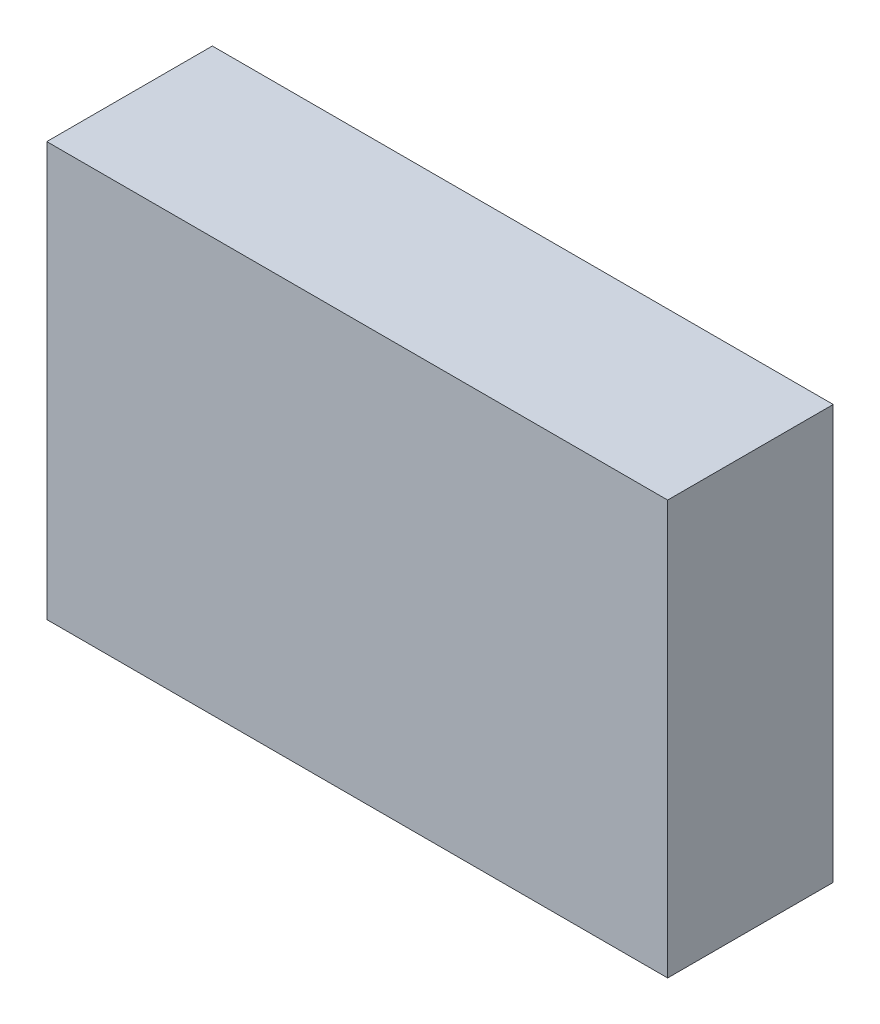
ISO-10303-21;
HEADER;
FILE_DESCRIPTION(('STEP AP214'),'2;1');
FILE_NAME('part.step','',(''),(''),'','','');
FILE_SCHEMA(('AUTOMOTIVE_DESIGN { 1 0 10303 214 1 1 1 1 }'));
ENDSEC;
DATA;
#1=APPLICATION_CONTEXT('core data for automotive mechanical design processes');
#2=APPLICATION_PROTOCOL_DEFINITION('international standard','automotive_design',2000,#1);
#3=PRODUCT_CONTEXT('',#1,'mechanical');
#4=PRODUCT('Part','Part','',(#3));
#5=PRODUCT_RELATED_PRODUCT_CATEGORY('part','',(#4));
#6=PRODUCT_DEFINITION_FORMATION('','',#4);
#7=PRODUCT_DEFINITION_CONTEXT('part definition',#1,'design');
#8=PRODUCT_DEFINITION('design','',#6,#7);
#9=PRODUCT_DEFINITION_SHAPE('','',#8);
#10=(LENGTH_UNIT() NAMED_UNIT(*) SI_UNIT(.MILLI.,.METRE.));
#11=(NAMED_UNIT(*) PLANE_ANGLE_UNIT() SI_UNIT($,.RADIAN.));
#12=(NAMED_UNIT(*) SI_UNIT($,.STERADIAN.) SOLID_ANGLE_UNIT());
#13=UNCERTAINTY_MEASURE_WITH_UNIT(LENGTH_MEASURE(1.E-05),#10,'distance_accuracy_value','');
#14=(GEOMETRIC_REPRESENTATION_CONTEXT(3) GLOBAL_UNCERTAINTY_ASSIGNED_CONTEXT((#13)) GLOBAL_UNIT_ASSIGNED_CONTEXT((#10,
#11,#12)) REPRESENTATION_CONTEXT('',''));
#15=CARTESIAN_POINT('',(0.,0.,0.));
#16=DIRECTION('',(0.,0.,1.));
#17=DIRECTION('',(1.,0.,0.));
#18=AXIS2_PLACEMENT_3D('',#15,#16,#17);
#19=CARTESIAN_POINT('',(18.75,-12.5,10.));
#20=DIRECTION('',(-1.,0.,0.));
#21=DIRECTION('',(0.,0.,1.));
#22=AXIS2_PLACEMENT_3D('',#19,#20,#21);
#23=PLANE('',#22);
#24=DIRECTION('',(0.,1.,0.));
#25=VECTOR('',#24,1.);
#26=CARTESIAN_POINT('',(18.75,-12.5,0.));
#27=LINE('',#26,#25);
#28=CARTESIAN_POINT('',(18.75,-12.5,0.));
#29=VERTEX_POINT('',#28);
#30=CARTESIAN_POINT('',(18.75,12.5,0.));
#31=VERTEX_POINT('',#30);
#32=EDGE_CURVE('E96',#29,#31,#27,.T.);
#33=ORIENTED_EDGE('',*,*,#32,.T.);
#34=DIRECTION('',(0.,0.,-1.));
#35=VECTOR('',#34,1.);
#36=CARTESIAN_POINT('',(18.75,12.5,10.));
#37=LINE('',#36,#35);
#38=CARTESIAN_POINT('',(18.75,12.5,10.));
#39=VERTEX_POINT('',#38);
#40=EDGE_CURVE('E11',#39,#31,#37,.T.);
#41=ORIENTED_EDGE('',*,*,#40,.F.);
#42=DIRECTION('',(0.,1.,0.));
#43=VECTOR('',#42,1.);
#44=CARTESIAN_POINT('',(18.75,-12.5,10.));
#45=LINE('',#44,#43);
#46=CARTESIAN_POINT('',(18.75,-12.5,10.));
#47=VERTEX_POINT('',#46);
#48=EDGE_CURVE('E84',#47,#39,#45,.T.);
#49=ORIENTED_EDGE('',*,*,#48,.F.);
#50=DIRECTION('',(0.,0.,-1.));
#51=VECTOR('',#50,1.);
#52=CARTESIAN_POINT('',(18.75,-12.5,10.));
#53=LINE('',#52,#51);
#54=EDGE_CURVE('E92',#47,#29,#53,.T.);
#55=ORIENTED_EDGE('',*,*,#54,.T.);
#56=EDGE_LOOP('',(#33,#41,#49,#55));
#57=FACE_BOUND('',#56,.T.);
#58=ADVANCED_FACE('F33',(#57),#23,.F.);
#59=CARTESIAN_POINT('',(-18.75,12.5,10.));
#60=DIRECTION('',(0.,-1.,0.));
#61=DIRECTION('',(0.,0.,-1.));
#62=AXIS2_PLACEMENT_3D('',#59,#60,#61);
#63=PLANE('',#62);
#64=DIRECTION('',(-1.,0.,0.));
#65=VECTOR('',#64,1.);
#66=CARTESIAN_POINT('',(-18.75,12.5,0.));
#67=LINE('',#66,#65);
#68=CARTESIAN_POINT('',(-18.75,12.5,0.));
#69=VERTEX_POINT('',#68);
#70=EDGE_CURVE('E88',#31,#69,#67,.T.);
#71=ORIENTED_EDGE('',*,*,#70,.T.);
#72=DIRECTION('',(0.,0.,-1.));
#73=VECTOR('',#72,1.);
#74=CARTESIAN_POINT('',(-18.75,12.5,10.));
#75=LINE('',#74,#73);
#76=CARTESIAN_POINT('',(-18.75,12.5,10.));
#77=VERTEX_POINT('',#76);
#78=EDGE_CURVE('E41',#77,#69,#75,.T.);
#79=ORIENTED_EDGE('',*,*,#78,.F.);
#80=DIRECTION('',(-1.,0.,0.));
#81=VECTOR('',#80,1.);
#82=CARTESIAN_POINT('',(-18.75,12.5,10.));
#83=LINE('',#82,#81);
#84=EDGE_CURVE('E79',#39,#77,#83,.T.);
#85=ORIENTED_EDGE('',*,*,#84,.F.);
#86=ORIENTED_EDGE('',*,*,#40,.T.);
#87=EDGE_LOOP('',(#71,#79,#85,#86));
#88=FACE_BOUND('',#87,.T.);
#89=ADVANCED_FACE('F87',(#88),#63,.F.);
#90=CARTESIAN_POINT('',(-18.75,-12.5,10.));
#91=DIRECTION('',(1.,0.,0.));
#92=DIRECTION('',(0.,0.,-1.));
#93=AXIS2_PLACEMENT_3D('',#90,#91,#92);
#94=PLANE('',#93);
#95=DIRECTION('',(0.,-1.,0.));
#96=VECTOR('',#95,1.);
#97=CARTESIAN_POINT('',(-18.75,-12.5,0.));
#98=LINE('',#97,#96);
#99=CARTESIAN_POINT('',(-18.75,-12.5,0.));
#100=VERTEX_POINT('',#99);
#101=EDGE_CURVE('E66',#69,#100,#98,.T.);
#102=ORIENTED_EDGE('',*,*,#101,.T.);
#103=DIRECTION('',(0.,0.,-1.));
#104=VECTOR('',#103,1.);
#105=CARTESIAN_POINT('',(-18.75,-12.5,10.));
#106=LINE('',#105,#104);
#107=CARTESIAN_POINT('',(-18.75,-12.5,10.));
#108=VERTEX_POINT('',#107);
#109=EDGE_CURVE('E89',#108,#100,#106,.T.);
#110=ORIENTED_EDGE('',*,*,#109,.F.);
#111=DIRECTION('',(0.,-1.,0.));
#112=VECTOR('',#111,1.);
#113=CARTESIAN_POINT('',(-18.75,-12.5,10.));
#114=LINE('',#113,#112);
#115=EDGE_CURVE('E82',#77,#108,#114,.T.);
#116=ORIENTED_EDGE('',*,*,#115,.F.);
#117=ORIENTED_EDGE('',*,*,#78,.T.);
#118=EDGE_LOOP('',(#102,#110,#116,#117));
#119=FACE_BOUND('',#118,.T.);
#120=ADVANCED_FACE('F90',(#119),#94,.F.);
#121=CARTESIAN_POINT('',(-18.75,-12.5,10.));
#122=DIRECTION('',(0.,1.,0.));
#123=DIRECTION('',(0.,0.,1.));
#124=AXIS2_PLACEMENT_3D('',#121,#122,#123);
#125=PLANE('',#124);
#126=DIRECTION('',(1.,0.,0.));
#127=VECTOR('',#126,1.);
#128=CARTESIAN_POINT('',(-18.75,-12.5,0.));
#129=LINE('',#128,#127);
#130=EDGE_CURVE('E72',#100,#29,#129,.T.);
#131=ORIENTED_EDGE('',*,*,#130,.T.);
#132=ORIENTED_EDGE('',*,*,#54,.F.);
#133=DIRECTION('',(1.,0.,0.));
#134=VECTOR('',#133,1.);
#135=CARTESIAN_POINT('',(-18.75,-12.5,10.));
#136=LINE('',#135,#134);
#137=EDGE_CURVE('E49',#108,#47,#136,.T.);
#138=ORIENTED_EDGE('',*,*,#137,.F.);
#139=ORIENTED_EDGE('',*,*,#109,.T.);
#140=EDGE_LOOP('',(#131,#132,#138,#139));
#141=FACE_BOUND('',#140,.T.);
#142=ADVANCED_FACE('F103',(#141),#125,.F.);
#143=CARTESIAN_POINT('',(0.,0.,10.));
#144=DIRECTION('',(0.,0.,-1.));
#145=DIRECTION('',(-1.,0.,0.));
#146=AXIS2_PLACEMENT_3D('',#143,#144,#145);
#147=PLANE('',#146);
#148=ORIENTED_EDGE('',*,*,#48,.T.);
#149=ORIENTED_EDGE('',*,*,#84,.T.);
#150=ORIENTED_EDGE('',*,*,#115,.T.);
#151=ORIENTED_EDGE('',*,*,#137,.T.);
#152=EDGE_LOOP('',(#148,#149,#150,#151));
#153=FACE_BOUND('',#152,.T.);
#154=ADVANCED_FACE('F80',(#153),#147,.F.);
#155=CARTESIAN_POINT('',(0.,0.,0.));
#156=DIRECTION('',(0.,0.,-1.));
#157=DIRECTION('',(-1.,0.,0.));
#158=AXIS2_PLACEMENT_3D('',#155,#156,#157);
#159=PLANE('',#158);
#160=ORIENTED_EDGE('',*,*,#32,.F.);
#161=ORIENTED_EDGE('',*,*,#130,.F.);
#162=ORIENTED_EDGE('',*,*,#101,.F.);
#163=ORIENTED_EDGE('',*,*,#70,.F.);
#164=EDGE_LOOP('',(#160,#161,#162,#163));
#165=FACE_BOUND('',#164,.T.);
#166=ADVANCED_FACE('F106',(#165),#159,.T.);
#167=CLOSED_SHELL('',(#58,#89,#120,#142,#154,#166));
#168=MANIFOLD_SOLID_BREP('B2',#167);
#169=ADVANCED_BREP_SHAPE_REPRESENTATION('',(#18,#168),#14);
#170=SHAPE_DEFINITION_REPRESENTATION(#9,#169);
ENDSEC;
END-ISO-10303-21;
